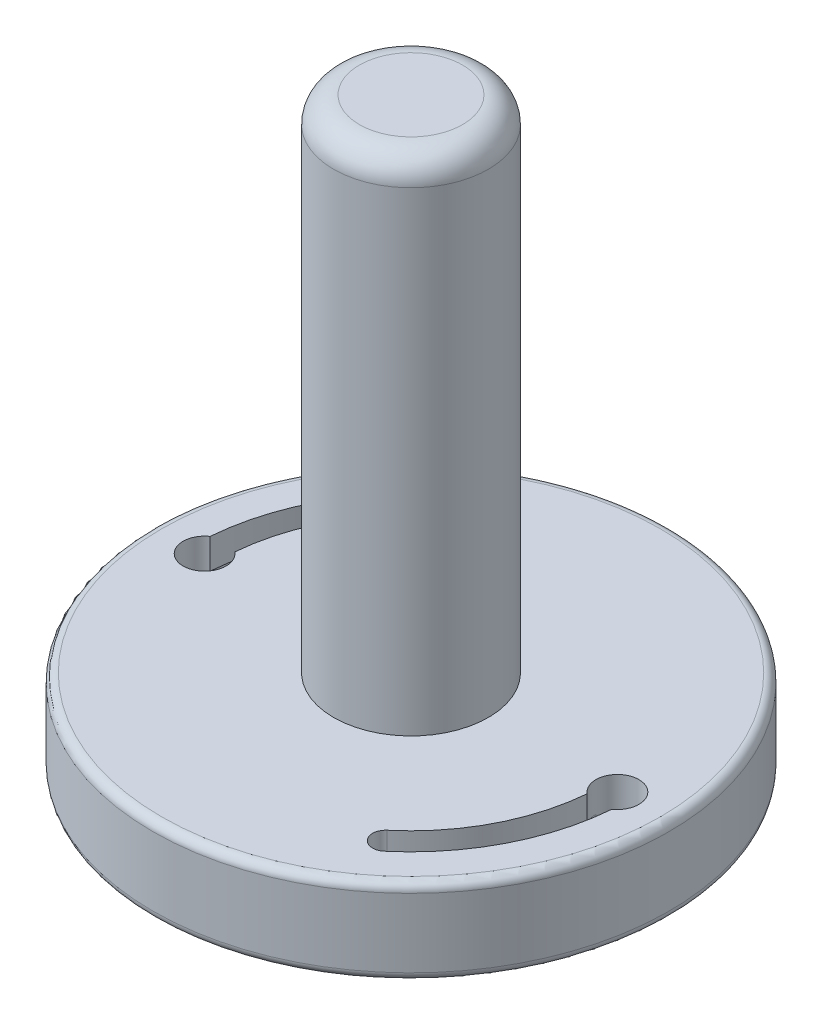
ISO-10303-21;
HEADER;
FILE_DESCRIPTION(('STEP AP214'),'2;1');
FILE_NAME('part.step','',(''),(''),'','','');
FILE_SCHEMA(('AUTOMOTIVE_DESIGN { 1 0 10303 214 1 1 1 1 }'));
ENDSEC;
DATA;
#1=APPLICATION_CONTEXT('core data for automotive mechanical design processes');
#2=APPLICATION_PROTOCOL_DEFINITION('international standard','automotive_design',2000,#1);
#3=PRODUCT_CONTEXT('',#1,'mechanical');
#4=PRODUCT('Part','Part','',(#3));
#5=PRODUCT_RELATED_PRODUCT_CATEGORY('part','',(#4));
#6=PRODUCT_DEFINITION_FORMATION('','',#4);
#7=PRODUCT_DEFINITION_CONTEXT('part definition',#1,'design');
#8=PRODUCT_DEFINITION('design','',#6,#7);
#9=PRODUCT_DEFINITION_SHAPE('','',#8);
#10=(LENGTH_UNIT() NAMED_UNIT(*) SI_UNIT(.MILLI.,.METRE.));
#11=(NAMED_UNIT(*) PLANE_ANGLE_UNIT() SI_UNIT($,.RADIAN.));
#12=(NAMED_UNIT(*) SI_UNIT($,.STERADIAN.) SOLID_ANGLE_UNIT());
#13=UNCERTAINTY_MEASURE_WITH_UNIT(LENGTH_MEASURE(1.E-05),#10,'distance_accuracy_value','');
#14=(GEOMETRIC_REPRESENTATION_CONTEXT(3) GLOBAL_UNCERTAINTY_ASSIGNED_CONTEXT((#13)) GLOBAL_UNIT_ASSIGNED_CONTEXT((#10,
#11,#12)) REPRESENTATION_CONTEXT('',''));
#15=CARTESIAN_POINT('',(0.,0.,0.));
#16=DIRECTION('',(0.,0.,1.));
#17=DIRECTION('',(1.,0.,0.));
#18=AXIS2_PLACEMENT_3D('',#15,#16,#17);
#19=CARTESIAN_POINT('',(0.,12.7,0.));
#20=DIRECTION('',(0.,-1.,0.));
#21=DIRECTION('',(0.,0.,-1.));
#22=AXIS2_PLACEMENT_3D('',#19,#20,#21);
#23=CYLINDRICAL_SURFACE('',#22,38.1);
#24=CARTESIAN_POINT('',(0.,1.27,0.));
#25=DIRECTION('',(0.,1.,0.));
#26=DIRECTION('',(0.,0.,1.));
#27=AXIS2_PLACEMENT_3D('',#24,#25,#26);
#28=CIRCLE('',#27,38.1);
#29=CARTESIAN_POINT('',(0.,1.27,38.1));
#30=VERTEX_POINT('',#29);
#31=EDGE_CURVE('E284',#30,#30,#28,.T.);
#32=ORIENTED_EDGE('',*,*,#31,.T.);
#33=EDGE_LOOP('',(#32));
#34=FACE_BOUND('',#33,.T.);
#35=CARTESIAN_POINT('',(0.,11.43,0.));
#36=DIRECTION('',(0.,1.,0.));
#37=DIRECTION('',(0.,0.,1.));
#38=AXIS2_PLACEMENT_3D('',#35,#36,#37);
#39=CIRCLE('',#38,38.1);
#40=CARTESIAN_POINT('',(0.,11.43,38.1));
#41=VERTEX_POINT('',#40);
#42=EDGE_CURVE('E281',#41,#41,#39,.F.);
#43=ORIENTED_EDGE('',*,*,#42,.T.);
#44=EDGE_LOOP('',(#43));
#45=FACE_BOUND('',#44,.T.);
#46=ADVANCED_FACE('F35',(#34,#45),#23,.T.);
#47=CARTESIAN_POINT('',(0.,12.7,0.));
#48=DIRECTION('',(0.,1.,0.));
#49=DIRECTION('',(0.,0.,1.));
#50=AXIS2_PLACEMENT_3D('',#47,#48,#49);
#51=PLANE('',#50);
#52=CARTESIAN_POINT('',(0.,12.7,0.));
#53=DIRECTION('',(0.,1.,0.));
#54=DIRECTION('',(0.,0.,1.));
#55=AXIS2_PLACEMENT_3D('',#52,#53,#54);
#56=CIRCLE('',#55,32.385);
#57=CARTESIAN_POINT('',(20.8166767396913,12.7,24.8083492904142));
#58=VERTEX_POINT('',#57);
#59=CARTESIAN_POINT('',(32.2791666666659,12.7,2.61603216830468));
#60=VERTEX_POINT('',#59);
#61=EDGE_CURVE('E50',#58,#60,#56,.T.);
#62=ORIENTED_EDGE('',*,*,#61,.F.);
#63=CARTESIAN_POINT('',(19.5921663432389,12.7,23.3490346262722));
#64=DIRECTION('',(0.,1.,0.));
#65=DIRECTION('',(0.,0.,1.));
#66=AXIS2_PLACEMENT_3D('',#63,#64,#65);
#67=CIRCLE('',#66,1.905);
#68=CARTESIAN_POINT('',(18.3676559467864,12.7,21.8897199621302));
#69=VERTEX_POINT('',#68);
#70=EDGE_CURVE('E225',#69,#58,#67,.T.);
#71=ORIENTED_EDGE('',*,*,#70,.F.);
#72=CARTESIAN_POINT('',(0.,12.7,0.));
#73=DIRECTION('',(0.,-1.,0.));
#74=DIRECTION('',(0.,0.,1.));
#75=AXIS2_PLACEMENT_3D('',#72,#73,#74);
#76=CIRCLE('',#75,28.575);
#77=CARTESIAN_POINT('',(28.4691666666659,12.7,2.45706619886328));
#78=VERTEX_POINT('',#77);
#79=EDGE_CURVE('E236',#78,#69,#76,.T.);
#80=ORIENTED_EDGE('',*,*,#79,.F.);
#81=CARTESIAN_POINT('',(30.48,12.7,8.88324318369062E-12));
#82=DIRECTION('',(0.,1.,0.));
#83=DIRECTION('',(0.,0.,1.));
#84=AXIS2_PLACEMENT_3D('',#81,#82,#83);
#85=CIRCLE('',#84,3.17500000000002);
#86=EDGE_CURVE('E234',#60,#78,#85,.T.);
#87=ORIENTED_EDGE('',*,*,#86,.F.);
#88=EDGE_LOOP('',(#62,#71,#80,#87));
#89=FACE_BOUND('',#88,.T.);
#90=CARTESIAN_POINT('',(0.,12.7,0.));
#91=DIRECTION('',(0.,1.,0.));
#92=DIRECTION('',(0.,0.,1.));
#93=AXIS2_PLACEMENT_3D('',#90,#91,#92);
#94=CIRCLE('',#93,32.385);
#95=CARTESIAN_POINT('',(-20.8166767396985,12.7,-24.8083492904081));
#96=VERTEX_POINT('',#95);
#97=CARTESIAN_POINT('',(-32.2791666666667,12.7,-2.61603216829525));
#98=VERTEX_POINT('',#97);
#99=EDGE_CURVE('E58',#96,#98,#94,.T.);
#100=ORIENTED_EDGE('',*,*,#99,.F.);
#101=CARTESIAN_POINT('',(-19.5921663432457,12.7,-23.3490346262665));
#102=DIRECTION('',(0.,1.,0.));
#103=DIRECTION('',(0.,0.,1.));
#104=AXIS2_PLACEMENT_3D('',#101,#102,#103);
#105=CIRCLE('',#104,1.905);
#106=CARTESIAN_POINT('',(-18.3676559467928,12.7,-21.8897199621248));
#107=VERTEX_POINT('',#106);
#108=EDGE_CURVE('E251',#107,#96,#105,.T.);
#109=ORIENTED_EDGE('',*,*,#108,.F.);
#110=CARTESIAN_POINT('',(0.,12.7,0.));
#111=DIRECTION('',(0.,-1.,0.));
#112=DIRECTION('',(0.,0.,1.));
#113=AXIS2_PLACEMENT_3D('',#110,#111,#112);
#114=CIRCLE('',#113,28.575);
#115=CARTESIAN_POINT('',(-28.4691666666667,12.7,-2.45706619885496));
#116=VERTEX_POINT('',#115);
#117=EDGE_CURVE('E263',#116,#107,#114,.T.);
#118=ORIENTED_EDGE('',*,*,#117,.F.);
#119=CARTESIAN_POINT('',(-30.48,12.7,0.));
#120=DIRECTION('',(0.,1.,0.));
#121=DIRECTION('',(0.,0.,1.));
#122=AXIS2_PLACEMENT_3D('',#119,#120,#121);
#123=CIRCLE('',#122,3.17499999999999);
#124=EDGE_CURVE('E260',#98,#116,#123,.T.);
#125=ORIENTED_EDGE('',*,*,#124,.F.);
#126=EDGE_LOOP('',(#100,#109,#118,#125));
#127=FACE_BOUND('',#126,.T.);
#128=CARTESIAN_POINT('',(0.,12.7,0.));
#129=DIRECTION('',(0.,1.,0.));
#130=DIRECTION('',(0.,0.,1.));
#131=AXIS2_PLACEMENT_3D('',#128,#129,#130);
#132=CIRCLE('',#131,36.83);
#133=CARTESIAN_POINT('',(0.,12.7,36.83));
#134=VERTEX_POINT('',#133);
#135=EDGE_CURVE('E278',#134,#134,#132,.T.);
#136=ORIENTED_EDGE('',*,*,#135,.T.);
#137=EDGE_LOOP('',(#136));
#138=FACE_BOUND('',#137,.T.);
#139=CARTESIAN_POINT('',(0.,12.7,0.));
#140=DIRECTION('',(0.,1.,0.));
#141=DIRECTION('',(0.,0.,1.));
#142=AXIS2_PLACEMENT_3D('',#139,#140,#141);
#143=CIRCLE('',#142,11.43);
#144=CARTESIAN_POINT('',(0.,12.7,11.43));
#145=VERTEX_POINT('',#144);
#146=EDGE_CURVE('E270',#145,#145,#143,.T.);
#147=ORIENTED_EDGE('',*,*,#146,.F.);
#148=EDGE_LOOP('',(#147));
#149=FACE_BOUND('',#148,.T.);
#150=ADVANCED_FACE('F308',(#89,#127,#138,#149),#51,.T.);
#151=CARTESIAN_POINT('',(0.,0.,0.));
#152=DIRECTION('',(0.,1.,0.));
#153=DIRECTION('',(0.,0.,1.));
#154=AXIS2_PLACEMENT_3D('',#151,#152,#153);
#155=PLANE('',#154);
#156=CARTESIAN_POINT('',(0.,0.,0.));
#157=DIRECTION('',(0.,1.,0.));
#158=DIRECTION('',(0.,0.,1.));
#159=AXIS2_PLACEMENT_3D('',#156,#157,#158);
#160=CIRCLE('',#159,36.83);
#161=CARTESIAN_POINT('',(0.,0.,36.83));
#162=VERTEX_POINT('',#161);
#163=EDGE_CURVE('E287',#162,#162,#160,.F.);
#164=ORIENTED_EDGE('',*,*,#163,.T.);
#165=EDGE_LOOP('',(#164));
#166=FACE_BOUND('',#165,.T.);
#167=ADVANCED_FACE('F315',(#166),#155,.F.);
#168=CARTESIAN_POINT('',(0.,86.614,0.));
#169=DIRECTION('',(0.,-1.,0.));
#170=DIRECTION('',(0.,0.,-1.));
#171=AXIS2_PLACEMENT_3D('',#168,#169,#170);
#172=CYLINDRICAL_SURFACE('',#171,11.43);
#173=CARTESIAN_POINT('',(0.,82.804,0.));
#174=DIRECTION('',(0.,1.,0.));
#175=DIRECTION('',(0.,0.,1.));
#176=AXIS2_PLACEMENT_3D('',#173,#174,#175);
#177=CIRCLE('',#176,11.43);
#178=CARTESIAN_POINT('',(0.,82.804,11.43));
#179=VERTEX_POINT('',#178);
#180=EDGE_CURVE('E11',#179,#179,#177,.F.);
#181=ORIENTED_EDGE('',*,*,#180,.T.);
#182=EDGE_LOOP('',(#181));
#183=FACE_BOUND('',#182,.T.);
#184=ORIENTED_EDGE('',*,*,#146,.T.);
#185=EDGE_LOOP('',(#184));
#186=FACE_BOUND('',#185,.T.);
#187=ADVANCED_FACE('F326',(#183,#186),#172,.T.);
#188=CARTESIAN_POINT('',(0.,86.614,0.));
#189=DIRECTION('',(0.,1.,0.));
#190=DIRECTION('',(0.,0.,1.));
#191=AXIS2_PLACEMENT_3D('',#188,#189,#190);
#192=PLANE('',#191);
#193=CARTESIAN_POINT('',(0.,86.614,0.));
#194=DIRECTION('',(0.,1.,0.));
#195=DIRECTION('',(0.,0.,1.));
#196=AXIS2_PLACEMENT_3D('',#193,#194,#195);
#197=CIRCLE('',#196,7.62);
#198=CARTESIAN_POINT('',(0.,86.614,7.62));
#199=VERTEX_POINT('',#198);
#200=EDGE_CURVE('E43',#199,#199,#197,.T.);
#201=ORIENTED_EDGE('',*,*,#200,.T.);
#202=EDGE_LOOP('',(#201));
#203=FACE_BOUND('',#202,.T.);
#204=ADVANCED_FACE('F292',(#203),#192,.T.);
#205=CARTESIAN_POINT('',(0.,11.43,0.));
#206=DIRECTION('',(0.,1.,0.));
#207=DIRECTION('',(0.,0.,1.));
#208=AXIS2_PLACEMENT_3D('',#205,#206,#207);
#209=TOROIDAL_SURFACE('',#208,36.83,1.27);
#210=ORIENTED_EDGE('',*,*,#42,.F.);
#211=EDGE_LOOP('',(#210));
#212=FACE_BOUND('',#211,.T.);
#213=ORIENTED_EDGE('',*,*,#135,.F.);
#214=EDGE_LOOP('',(#213));
#215=FACE_BOUND('',#214,.T.);
#216=ADVANCED_FACE('F304',(#212,#215),#209,.T.);
#217=CARTESIAN_POINT('',(0.,1.27,0.));
#218=DIRECTION('',(0.,1.,0.));
#219=DIRECTION('',(0.,0.,1.));
#220=AXIS2_PLACEMENT_3D('',#217,#218,#219);
#221=TOROIDAL_SURFACE('',#220,36.83,1.27);
#222=ORIENTED_EDGE('',*,*,#163,.F.);
#223=EDGE_LOOP('',(#222));
#224=FACE_BOUND('',#223,.T.);
#225=ORIENTED_EDGE('',*,*,#31,.F.);
#226=EDGE_LOOP('',(#225));
#227=FACE_BOUND('',#226,.T.);
#228=ADVANCED_FACE('F296',(#224,#227),#221,.T.);
#229=CARTESIAN_POINT('',(0.,82.804,0.));
#230=DIRECTION('',(0.,1.,0.));
#231=DIRECTION('',(0.,0.,1.));
#232=AXIS2_PLACEMENT_3D('',#229,#230,#231);
#233=TOROIDAL_SURFACE('',#232,7.62,3.81);
#234=ORIENTED_EDGE('',*,*,#180,.F.);
#235=EDGE_LOOP('',(#234));
#236=FACE_BOUND('',#235,.T.);
#237=ORIENTED_EDGE('',*,*,#200,.F.);
#238=EDGE_LOOP('',(#237));
#239=FACE_BOUND('',#238,.T.);
#240=ADVANCED_FACE('F37',(#236,#239),#233,.T.);
#241=CARTESIAN_POINT('',(0.,8.255,0.));
#242=DIRECTION('',(0.,1.,0.));
#243=DIRECTION('',(0.,0.,1.));
#244=AXIS2_PLACEMENT_3D('',#241,#242,#243);
#245=CYLINDRICAL_SURFACE('',#244,32.385);
#246=ORIENTED_EDGE('',*,*,#99,.T.);
#247=DIRECTION('',(0.,1.,0.));
#248=VECTOR('',#247,1.);
#249=CARTESIAN_POINT('',(-32.2791666666667,8.255,-2.61603216829525));
#250=LINE('',#249,#248);
#251=CARTESIAN_POINT('',(-32.2791666666667,8.255,-2.61603216829525));
#252=VERTEX_POINT('',#251);
#253=EDGE_CURVE('E258',#252,#98,#250,.T.);
#254=ORIENTED_EDGE('',*,*,#253,.F.);
#255=CARTESIAN_POINT('',(0.,8.255,0.));
#256=DIRECTION('',(0.,1.,0.));
#257=DIRECTION('',(0.,0.,1.));
#258=AXIS2_PLACEMENT_3D('',#255,#256,#257);
#259=CIRCLE('',#258,32.385);
#260=CARTESIAN_POINT('',(-20.8166767396985,8.255,-24.8083492904081));
#261=VERTEX_POINT('',#260);
#262=EDGE_CURVE('E248',#261,#252,#259,.T.);
#263=ORIENTED_EDGE('',*,*,#262,.F.);
#264=DIRECTION('',(0.,1.,0.));
#265=VECTOR('',#264,1.);
#266=CARTESIAN_POINT('',(-20.8166767396985,8.255,-24.8083492904081));
#267=LINE('',#266,#265);
#268=EDGE_CURVE('E268',#261,#96,#267,.T.);
#269=ORIENTED_EDGE('',*,*,#268,.T.);
#270=EDGE_LOOP('',(#246,#254,#263,#269));
#271=FACE_BOUND('',#270,.T.);
#272=ADVANCED_FACE('F295',(#271),#245,.F.);
#273=CARTESIAN_POINT('',(-19.5921663432457,8.255,-23.3490346262665));
#274=DIRECTION('',(0.,1.,0.));
#275=DIRECTION('',(0.,0.,1.));
#276=AXIS2_PLACEMENT_3D('',#273,#274,#275);
#277=CYLINDRICAL_SURFACE('',#276,1.905);
#278=ORIENTED_EDGE('',*,*,#108,.T.);
#279=ORIENTED_EDGE('',*,*,#268,.F.);
#280=CARTESIAN_POINT('',(-19.5921663432457,8.255,-23.3490346262665));
#281=DIRECTION('',(0.,1.,0.));
#282=DIRECTION('',(0.,0.,1.));
#283=AXIS2_PLACEMENT_3D('',#280,#281,#282);
#284=CIRCLE('',#283,1.905);
#285=CARTESIAN_POINT('',(-18.3676559467928,8.255,-21.8897199621248));
#286=VERTEX_POINT('',#285);
#287=EDGE_CURVE('E256',#286,#261,#284,.T.);
#288=ORIENTED_EDGE('',*,*,#287,.F.);
#289=DIRECTION('',(0.,1.,0.));
#290=VECTOR('',#289,1.);
#291=CARTESIAN_POINT('',(-18.3676559467928,8.255,-21.8897199621248));
#292=LINE('',#291,#290);
#293=EDGE_CURVE('E271',#286,#107,#292,.T.);
#294=ORIENTED_EDGE('',*,*,#293,.T.);
#295=EDGE_LOOP('',(#278,#279,#288,#294));
#296=FACE_BOUND('',#295,.T.);
#297=ADVANCED_FACE('F302',(#296),#277,.F.);
#298=CARTESIAN_POINT('',(0.,8.255,0.));
#299=DIRECTION('',(0.,1.,0.));
#300=DIRECTION('',(0.,0.,1.));
#301=AXIS2_PLACEMENT_3D('',#298,#299,#300);
#302=CYLINDRICAL_SURFACE('',#301,28.575);
#303=ORIENTED_EDGE('',*,*,#117,.T.);
#304=ORIENTED_EDGE('',*,*,#293,.F.);
#305=CARTESIAN_POINT('',(0.,8.255,0.));
#306=DIRECTION('',(0.,-1.,0.));
#307=DIRECTION('',(0.,0.,1.));
#308=AXIS2_PLACEMENT_3D('',#305,#306,#307);
#309=CIRCLE('',#308,28.575);
#310=CARTESIAN_POINT('',(-28.4691666666667,8.255,-2.45706619885496));
#311=VERTEX_POINT('',#310);
#312=EDGE_CURVE('E254',#311,#286,#309,.T.);
#313=ORIENTED_EDGE('',*,*,#312,.F.);
#314=DIRECTION('',(0.,1.,0.));
#315=VECTOR('',#314,1.);
#316=CARTESIAN_POINT('',(-28.4691666666667,8.255,-2.45706619885496));
#317=LINE('',#316,#315);
#318=EDGE_CURVE('E273',#311,#116,#317,.T.);
#319=ORIENTED_EDGE('',*,*,#318,.T.);
#320=EDGE_LOOP('',(#303,#304,#313,#319));
#321=FACE_BOUND('',#320,.T.);
#322=ADVANCED_FACE('F347',(#321),#302,.T.);
#323=CARTESIAN_POINT('',(-30.48,8.255,0.));
#324=DIRECTION('',(0.,1.,0.));
#325=DIRECTION('',(0.,0.,1.));
#326=AXIS2_PLACEMENT_3D('',#323,#324,#325);
#327=CYLINDRICAL_SURFACE('',#326,3.17499999999999);
#328=ORIENTED_EDGE('',*,*,#124,.T.);
#329=ORIENTED_EDGE('',*,*,#318,.F.);
#330=CARTESIAN_POINT('',(-30.48,8.255,0.));
#331=DIRECTION('',(0.,1.,0.));
#332=DIRECTION('',(0.,0.,1.));
#333=AXIS2_PLACEMENT_3D('',#330,#331,#332);
#334=CIRCLE('',#333,3.17499999999999);
#335=CARTESIAN_POINT('',(-27.305,8.255,0.));
#336=VERTEX_POINT('',#335);
#337=EDGE_CURVE('E250',#336,#311,#334,.T.);
#338=ORIENTED_EDGE('',*,*,#337,.F.);
#339=DIRECTION('',(0.,1.,0.));
#340=VECTOR('',#339,1.);
#341=CARTESIAN_POINT('',(-27.305,5.08,0.));
#342=LINE('',#341,#340);
#343=CARTESIAN_POINT('',(-27.305,5.08,0.));
#344=VERTEX_POINT('',#343);
#345=EDGE_CURVE('E206',#344,#336,#342,.T.);
#346=ORIENTED_EDGE('',*,*,#345,.F.);
#347=CARTESIAN_POINT('',(-30.48,5.08,0.));
#348=DIRECTION('',(0.,1.,0.));
#349=DIRECTION('',(0.,0.,1.));
#350=AXIS2_PLACEMENT_3D('',#347,#348,#349);
#351=CIRCLE('',#350,3.17500000000004);
#352=CARTESIAN_POINT('',(-33.655,5.08,0.));
#353=VERTEX_POINT('',#352);
#354=EDGE_CURVE('E193',#353,#344,#351,.T.);
#355=ORIENTED_EDGE('',*,*,#354,.F.);
#356=DIRECTION('',(0.,1.,0.));
#357=VECTOR('',#356,1.);
#358=CARTESIAN_POINT('',(-33.655,5.08,0.));
#359=LINE('',#358,#357);
#360=CARTESIAN_POINT('',(-33.655,8.255,0.));
#361=VERTEX_POINT('',#360);
#362=EDGE_CURVE('E214',#353,#361,#359,.T.);
#363=ORIENTED_EDGE('',*,*,#362,.T.);
#364=EDGE_CURVE('E252',#252,#361,#334,.T.);
#365=ORIENTED_EDGE('',*,*,#364,.F.);
#366=ORIENTED_EDGE('',*,*,#253,.T.);
#367=EDGE_LOOP('',(#328,#329,#338,#346,#355,#363,#365,#366));
#368=FACE_BOUND('',#367,.T.);
#369=ADVANCED_FACE('F343',(#368),#327,.F.);
#370=CARTESIAN_POINT('',(0.,8.255,0.));
#371=DIRECTION('',(0.,1.,0.));
#372=DIRECTION('',(0.,0.,1.));
#373=AXIS2_PLACEMENT_3D('',#370,#371,#372);
#374=CYLINDRICAL_SURFACE('',#373,32.385);
#375=ORIENTED_EDGE('',*,*,#61,.T.);
#376=DIRECTION('',(0.,1.,0.));
#377=VECTOR('',#376,1.);
#378=CARTESIAN_POINT('',(32.2791666666659,8.255,2.61603216830468));
#379=LINE('',#378,#377);
#380=CARTESIAN_POINT('',(32.2791666666659,8.255,2.61603216830468));
#381=VERTEX_POINT('',#380);
#382=EDGE_CURVE('E232',#381,#60,#379,.T.);
#383=ORIENTED_EDGE('',*,*,#382,.F.);
#384=CARTESIAN_POINT('',(0.,8.255,0.));
#385=DIRECTION('',(0.,1.,0.));
#386=DIRECTION('',(0.,0.,1.));
#387=AXIS2_PLACEMENT_3D('',#384,#385,#386);
#388=CIRCLE('',#387,32.385);
#389=CARTESIAN_POINT('',(20.8166767396913,8.255,24.8083492904142));
#390=VERTEX_POINT('',#389);
#391=EDGE_CURVE('E222',#390,#381,#388,.T.);
#392=ORIENTED_EDGE('',*,*,#391,.F.);
#393=DIRECTION('',(0.,1.,0.));
#394=VECTOR('',#393,1.);
#395=CARTESIAN_POINT('',(20.8166767396913,8.255,24.8083492904142));
#396=LINE('',#395,#394);
#397=EDGE_CURVE('E241',#390,#58,#396,.T.);
#398=ORIENTED_EDGE('',*,*,#397,.T.);
#399=EDGE_LOOP('',(#375,#383,#392,#398));
#400=FACE_BOUND('',#399,.T.);
#401=ADVANCED_FACE('F346',(#400),#374,.F.);
#402=CARTESIAN_POINT('',(19.5921663432389,8.255,23.3490346262722));
#403=DIRECTION('',(0.,1.,0.));
#404=DIRECTION('',(0.,0.,1.));
#405=AXIS2_PLACEMENT_3D('',#402,#403,#404);
#406=CYLINDRICAL_SURFACE('',#405,1.905);
#407=ORIENTED_EDGE('',*,*,#70,.T.);
#408=ORIENTED_EDGE('',*,*,#397,.F.);
#409=CARTESIAN_POINT('',(19.5921663432389,8.255,23.3490346262722));
#410=DIRECTION('',(0.,1.,0.));
#411=DIRECTION('',(0.,0.,1.));
#412=AXIS2_PLACEMENT_3D('',#409,#410,#411);
#413=CIRCLE('',#412,1.905);
#414=CARTESIAN_POINT('',(18.3676559467864,8.255,21.8897199621302));
#415=VERTEX_POINT('',#414);
#416=EDGE_CURVE('E230',#415,#390,#413,.T.);
#417=ORIENTED_EDGE('',*,*,#416,.F.);
#418=DIRECTION('',(0.,1.,0.));
#419=VECTOR('',#418,1.);
#420=CARTESIAN_POINT('',(18.3676559467864,8.255,21.8897199621302));
#421=LINE('',#420,#419);
#422=EDGE_CURVE('E243',#415,#69,#421,.T.);
#423=ORIENTED_EDGE('',*,*,#422,.T.);
#424=EDGE_LOOP('',(#407,#408,#417,#423));
#425=FACE_BOUND('',#424,.T.);
#426=ADVANCED_FACE('F357',(#425),#406,.F.);
#427=CARTESIAN_POINT('',(0.,8.255,0.));
#428=DIRECTION('',(0.,1.,0.));
#429=DIRECTION('',(0.,0.,1.));
#430=AXIS2_PLACEMENT_3D('',#427,#428,#429);
#431=CYLINDRICAL_SURFACE('',#430,28.575);
#432=ORIENTED_EDGE('',*,*,#79,.T.);
#433=ORIENTED_EDGE('',*,*,#422,.F.);
#434=CARTESIAN_POINT('',(0.,8.255,0.));
#435=DIRECTION('',(0.,-1.,0.));
#436=DIRECTION('',(0.,0.,1.));
#437=AXIS2_PLACEMENT_3D('',#434,#435,#436);
#438=CIRCLE('',#437,28.575);
#439=CARTESIAN_POINT('',(28.4691666666659,8.255,2.45706619886328));
#440=VERTEX_POINT('',#439);
#441=EDGE_CURVE('E228',#440,#415,#438,.T.);
#442=ORIENTED_EDGE('',*,*,#441,.F.);
#443=DIRECTION('',(0.,1.,0.));
#444=VECTOR('',#443,1.);
#445=CARTESIAN_POINT('',(28.4691666666659,8.255,2.45706619886328));
#446=LINE('',#445,#444);
#447=EDGE_CURVE('E245',#440,#78,#446,.T.);
#448=ORIENTED_EDGE('',*,*,#447,.T.);
#449=EDGE_LOOP('',(#432,#433,#442,#448));
#450=FACE_BOUND('',#449,.T.);
#451=ADVANCED_FACE('F361',(#450),#431,.T.);
#452=CARTESIAN_POINT('',(30.48,8.255,8.88324318369062E-12));
#453=DIRECTION('',(0.,1.,0.));
#454=DIRECTION('',(0.,0.,1.));
#455=AXIS2_PLACEMENT_3D('',#452,#453,#454);
#456=CYLINDRICAL_SURFACE('',#455,3.17500000000002);
#457=ORIENTED_EDGE('',*,*,#86,.T.);
#458=ORIENTED_EDGE('',*,*,#447,.F.);
#459=CARTESIAN_POINT('',(30.48,8.255,8.88324318369062E-12));
#460=DIRECTION('',(0.,1.,0.));
#461=DIRECTION('',(0.,0.,1.));
#462=AXIS2_PLACEMENT_3D('',#459,#460,#461);
#463=CIRCLE('',#462,3.17500000000002);
#464=CARTESIAN_POINT('',(27.305,8.255,1.896977325174E-13));
#465=VERTEX_POINT('',#464);
#466=EDGE_CURVE('E224',#465,#440,#463,.T.);
#467=ORIENTED_EDGE('',*,*,#466,.F.);
#468=DIRECTION('',(0.,1.,0.));
#469=VECTOR('',#468,1.);
#470=CARTESIAN_POINT('',(27.305,5.08,1.896977325174E-13));
#471=LINE('',#470,#469);
#472=CARTESIAN_POINT('',(27.305,5.08,1.896977325174E-13));
#473=VERTEX_POINT('',#472);
#474=EDGE_CURVE('E161',#473,#465,#471,.T.);
#475=ORIENTED_EDGE('',*,*,#474,.F.);
#476=CARTESIAN_POINT('',(30.48,5.08,2.12840702415877E-13));
#477=DIRECTION('',(0.,1.,0.));
#478=DIRECTION('',(0.,0.,1.));
#479=AXIS2_PLACEMENT_3D('',#476,#477,#478);
#480=CIRCLE('',#479,3.17500000000004);
#481=CARTESIAN_POINT('',(33.655,5.08,2.34889855334989E-13));
#482=VERTEX_POINT('',#481);
#483=EDGE_CURVE('E165',#482,#473,#480,.T.);
#484=ORIENTED_EDGE('',*,*,#483,.F.);
#485=DIRECTION('',(0.,1.,0.));
#486=VECTOR('',#485,1.);
#487=CARTESIAN_POINT('',(33.655,5.08,2.34889855334989E-13));
#488=LINE('',#487,#486);
#489=CARTESIAN_POINT('',(33.655,8.255,2.34889855334989E-13));
#490=VERTEX_POINT('',#489);
#491=EDGE_CURVE('E151',#482,#490,#488,.T.);
#492=ORIENTED_EDGE('',*,*,#491,.T.);
#493=EDGE_CURVE('E226',#381,#490,#463,.T.);
#494=ORIENTED_EDGE('',*,*,#493,.F.);
#495=ORIENTED_EDGE('',*,*,#382,.T.);
#496=EDGE_LOOP('',(#457,#458,#467,#475,#484,#492,#494,#495));
#497=FACE_BOUND('',#496,.T.);
#498=ADVANCED_FACE('F167',(#497),#456,.F.);
#499=CARTESIAN_POINT('',(0.,5.08,0.));
#500=DIRECTION('',(0.,1.,0.));
#501=DIRECTION('',(0.,0.,1.));
#502=AXIS2_PLACEMENT_3D('',#499,#500,#501);
#503=CYLINDRICAL_SURFACE('',#502,33.655);
#504=CARTESIAN_POINT('',(0.,8.255,0.));
#505=DIRECTION('',(0.,1.,0.));
#506=DIRECTION('',(0.,0.,1.));
#507=AXIS2_PLACEMENT_3D('',#504,#505,#506);
#508=CIRCLE('',#507,33.655);
#509=CARTESIAN_POINT('',(-21.6330170040004,8.255,-25.7812257331693));
#510=VERTEX_POINT('',#509);
#511=EDGE_CURVE('E197',#510,#361,#508,.T.);
#512=ORIENTED_EDGE('',*,*,#511,.T.);
#513=ORIENTED_EDGE('',*,*,#362,.F.);
#514=CARTESIAN_POINT('',(0.,5.08,0.));
#515=DIRECTION('',(0.,1.,0.));
#516=DIRECTION('',(0.,0.,1.));
#517=AXIS2_PLACEMENT_3D('',#514,#515,#516);
#518=CIRCLE('',#517,33.655);
#519=CARTESIAN_POINT('',(-21.6330170040004,5.08,-25.7812257331693));
#520=VERTEX_POINT('',#519);
#521=EDGE_CURVE('E203',#520,#353,#518,.T.);
#522=ORIENTED_EDGE('',*,*,#521,.F.);
#523=DIRECTION('',(0.,1.,0.));
#524=VECTOR('',#523,1.);
#525=CARTESIAN_POINT('',(-21.6330170040004,5.08,-25.7812257331693));
#526=LINE('',#525,#524);
#527=EDGE_CURVE('E217',#520,#510,#526,.T.);
#528=ORIENTED_EDGE('',*,*,#527,.T.);
#529=EDGE_LOOP('',(#512,#513,#522,#528));
#530=FACE_BOUND('',#529,.T.);
#531=ADVANCED_FACE('F360',(#530),#503,.F.);
#532=CARTESIAN_POINT('',(-19.5921663432457,5.08,-23.3490346262665));
#533=DIRECTION('',(0.,1.,0.));
#534=DIRECTION('',(0.,0.,1.));
#535=AXIS2_PLACEMENT_3D('',#532,#533,#534);
#536=CYLINDRICAL_SURFACE('',#535,3.175);
#537=CARTESIAN_POINT('',(-19.5921663432457,8.255,-23.3490346262665));
#538=DIRECTION('',(0.,1.,0.));
#539=DIRECTION('',(0.,0.,1.));
#540=AXIS2_PLACEMENT_3D('',#537,#538,#539);
#541=CIRCLE('',#540,3.175);
#542=CARTESIAN_POINT('',(-17.5513156824909,8.255,-20.9168435193637));
#543=VERTEX_POINT('',#542);
#544=EDGE_CURVE('E209',#543,#510,#541,.T.);
#545=ORIENTED_EDGE('',*,*,#544,.T.);
#546=ORIENTED_EDGE('',*,*,#527,.F.);
#547=CARTESIAN_POINT('',(-19.5921663432457,5.08,-23.3490346262665));
#548=DIRECTION('',(0.,1.,0.));
#549=DIRECTION('',(0.,0.,1.));
#550=AXIS2_PLACEMENT_3D('',#547,#548,#549);
#551=CIRCLE('',#550,3.175);
#552=CARTESIAN_POINT('',(-17.5513156824909,5.08,-20.9168435193637));
#553=VERTEX_POINT('',#552);
#554=EDGE_CURVE('E200',#553,#520,#551,.T.);
#555=ORIENTED_EDGE('',*,*,#554,.F.);
#556=DIRECTION('',(0.,1.,0.));
#557=VECTOR('',#556,1.);
#558=CARTESIAN_POINT('',(-17.5513156824909,5.08,-20.9168435193637));
#559=LINE('',#558,#557);
#560=EDGE_CURVE('E219',#553,#543,#559,.T.);
#561=ORIENTED_EDGE('',*,*,#560,.T.);
#562=EDGE_LOOP('',(#545,#546,#555,#561));
#563=FACE_BOUND('',#562,.T.);
#564=ADVANCED_FACE('F372',(#563),#536,.F.);
#565=CARTESIAN_POINT('',(0.,5.08,0.));
#566=DIRECTION('',(0.,1.,0.));
#567=DIRECTION('',(0.,0.,1.));
#568=AXIS2_PLACEMENT_3D('',#565,#566,#567);
#569=CYLINDRICAL_SURFACE('',#568,27.305);
#570=CARTESIAN_POINT('',(0.,8.255,0.));
#571=DIRECTION('',(0.,-1.,0.));
#572=DIRECTION('',(0.,0.,1.));
#573=AXIS2_PLACEMENT_3D('',#570,#571,#572);
#574=CIRCLE('',#573,27.305);
#575=EDGE_CURVE('E189',#336,#543,#574,.T.);
#576=ORIENTED_EDGE('',*,*,#575,.T.);
#577=ORIENTED_EDGE('',*,*,#560,.F.);
#578=CARTESIAN_POINT('',(0.,5.08,0.));
#579=DIRECTION('',(0.,-1.,0.));
#580=DIRECTION('',(0.,0.,1.));
#581=AXIS2_PLACEMENT_3D('',#578,#579,#580);
#582=CIRCLE('',#581,27.305);
#583=EDGE_CURVE('E196',#344,#553,#582,.T.);
#584=ORIENTED_EDGE('',*,*,#583,.F.);
#585=ORIENTED_EDGE('',*,*,#345,.T.);
#586=EDGE_LOOP('',(#576,#577,#584,#585));
#587=FACE_BOUND('',#586,.T.);
#588=ADVANCED_FACE('F368',(#587),#569,.T.);
#589=CARTESIAN_POINT('',(-15.24,5.08,0.));
#590=DIRECTION('',(0.,1.,0.));
#591=DIRECTION('',(0.,0.,1.));
#592=AXIS2_PLACEMENT_3D('',#589,#590,#591);
#593=PLANE('',#592);
#594=ORIENTED_EDGE('',*,*,#354,.T.);
#595=ORIENTED_EDGE('',*,*,#583,.T.);
#596=ORIENTED_EDGE('',*,*,#554,.T.);
#597=ORIENTED_EDGE('',*,*,#521,.T.);
#598=EDGE_LOOP('',(#594,#595,#596,#597));
#599=FACE_BOUND('',#598,.T.);
#600=ADVANCED_FACE('F371',(#599),#593,.T.);
#601=CARTESIAN_POINT('',(-15.24,8.255,0.));
#602=DIRECTION('',(0.,1.,0.));
#603=DIRECTION('',(0.,0.,1.));
#604=AXIS2_PLACEMENT_3D('',#601,#602,#603);
#605=PLANE('',#604);
#606=ORIENTED_EDGE('',*,*,#364,.T.);
#607=ORIENTED_EDGE('',*,*,#511,.F.);
#608=ORIENTED_EDGE('',*,*,#544,.F.);
#609=ORIENTED_EDGE('',*,*,#575,.F.);
#610=ORIENTED_EDGE('',*,*,#337,.T.);
#611=ORIENTED_EDGE('',*,*,#312,.T.);
#612=ORIENTED_EDGE('',*,*,#287,.T.);
#613=ORIENTED_EDGE('',*,*,#262,.T.);
#614=EDGE_LOOP('',(#606,#607,#608,#609,#610,#611,#612,#613));
#615=FACE_BOUND('',#614,.T.);
#616=ADVANCED_FACE('F380',(#615),#605,.F.);
#617=CARTESIAN_POINT('',(0.,5.08,0.));
#618=DIRECTION('',(0.,1.,0.));
#619=DIRECTION('',(0.,0.,1.));
#620=AXIS2_PLACEMENT_3D('',#617,#618,#619);
#621=CYLINDRICAL_SURFACE('',#620,33.655);
#622=CARTESIAN_POINT('',(0.,8.255,0.));
#623=DIRECTION('',(0.,1.,0.));
#624=DIRECTION('',(0.,0.,1.));
#625=AXIS2_PLACEMENT_3D('',#622,#623,#624);
#626=CIRCLE('',#625,33.655);
#627=CARTESIAN_POINT('',(21.6330170040003,8.255,25.7812257331694));
#628=VERTEX_POINT('',#627);
#629=EDGE_CURVE('E158',#628,#490,#626,.T.);
#630=ORIENTED_EDGE('',*,*,#629,.T.);
#631=ORIENTED_EDGE('',*,*,#491,.F.);
#632=CARTESIAN_POINT('',(0.,5.08,0.));
#633=DIRECTION('',(0.,1.,0.));
#634=DIRECTION('',(0.,0.,1.));
#635=AXIS2_PLACEMENT_3D('',#632,#633,#634);
#636=CIRCLE('',#635,33.655);
#637=CARTESIAN_POINT('',(21.6330170040003,5.08,25.7812257331694));
#638=VERTEX_POINT('',#637);
#639=EDGE_CURVE('E155',#638,#482,#636,.T.);
#640=ORIENTED_EDGE('',*,*,#639,.F.);
#641=DIRECTION('',(0.,1.,0.));
#642=VECTOR('',#641,1.);
#643=CARTESIAN_POINT('',(21.6330170040003,5.08,25.7812257331694));
#644=LINE('',#643,#642);
#645=EDGE_CURVE('E187',#638,#628,#644,.T.);
#646=ORIENTED_EDGE('',*,*,#645,.T.);
#647=EDGE_LOOP('',(#630,#631,#640,#646));
#648=FACE_BOUND('',#647,.T.);
#649=ADVANCED_FACE('F153',(#648),#621,.F.);
#650=CARTESIAN_POINT('',(19.5921663432455,5.08,23.3490346262666));
#651=DIRECTION('',(0.,1.,0.));
#652=DIRECTION('',(0.,0.,1.));
#653=AXIS2_PLACEMENT_3D('',#650,#651,#652);
#654=CYLINDRICAL_SURFACE('',#653,3.175);
#655=CARTESIAN_POINT('',(19.5921663432455,8.255,23.3490346262666));
#656=DIRECTION('',(0.,1.,0.));
#657=DIRECTION('',(0.,0.,1.));
#658=AXIS2_PLACEMENT_3D('',#655,#656,#657);
#659=CIRCLE('',#658,3.175);
#660=CARTESIAN_POINT('',(17.5513156824908,8.255,20.9168435193638));
#661=VERTEX_POINT('',#660);
#662=EDGE_CURVE('E176',#661,#628,#659,.T.);
#663=ORIENTED_EDGE('',*,*,#662,.T.);
#664=ORIENTED_EDGE('',*,*,#645,.F.);
#665=CARTESIAN_POINT('',(19.5921663432455,5.08,23.3490346262666));
#666=DIRECTION('',(0.,1.,0.));
#667=DIRECTION('',(0.,0.,1.));
#668=AXIS2_PLACEMENT_3D('',#665,#666,#667);
#669=CIRCLE('',#668,3.175);
#670=CARTESIAN_POINT('',(17.5513156824908,5.08,20.9168435193638));
#671=VERTEX_POINT('',#670);
#672=EDGE_CURVE('E162',#671,#638,#669,.T.);
#673=ORIENTED_EDGE('',*,*,#672,.F.);
#674=DIRECTION('',(0.,1.,0.));
#675=VECTOR('',#674,1.);
#676=CARTESIAN_POINT('',(17.5513156824908,5.08,20.9168435193638));
#677=LINE('',#676,#675);
#678=EDGE_CURVE('E190',#671,#661,#677,.T.);
#679=ORIENTED_EDGE('',*,*,#678,.T.);
#680=EDGE_LOOP('',(#663,#664,#673,#679));
#681=FACE_BOUND('',#680,.T.);
#682=ADVANCED_FACE('F389',(#681),#654,.F.);
#683=CARTESIAN_POINT('',(0.,5.08,0.));
#684=DIRECTION('',(0.,1.,0.));
#685=DIRECTION('',(0.,0.,1.));
#686=AXIS2_PLACEMENT_3D('',#683,#684,#685);
#687=CYLINDRICAL_SURFACE('',#686,27.305);
#688=CARTESIAN_POINT('',(0.,8.255,0.));
#689=DIRECTION('',(0.,-1.,0.));
#690=DIRECTION('',(0.,0.,1.));
#691=AXIS2_PLACEMENT_3D('',#688,#689,#690);
#692=CIRCLE('',#691,27.305);
#693=EDGE_CURVE('E179',#465,#661,#692,.T.);
#694=ORIENTED_EDGE('',*,*,#693,.T.);
#695=ORIENTED_EDGE('',*,*,#678,.F.);
#696=CARTESIAN_POINT('',(0.,5.08,0.));
#697=DIRECTION('',(0.,-1.,0.));
#698=DIRECTION('',(0.,0.,1.));
#699=AXIS2_PLACEMENT_3D('',#696,#697,#698);
#700=CIRCLE('',#699,27.305);
#701=EDGE_CURVE('E172',#473,#671,#700,.T.);
#702=ORIENTED_EDGE('',*,*,#701,.F.);
#703=ORIENTED_EDGE('',*,*,#474,.T.);
#704=EDGE_LOOP('',(#694,#695,#702,#703));
#705=FACE_BOUND('',#704,.T.);
#706=ADVANCED_FACE('F390',(#705),#687,.T.);
#707=CARTESIAN_POINT('',(15.24,5.08,1.06420351207939E-13));
#708=DIRECTION('',(0.,1.,0.));
#709=DIRECTION('',(0.,0.,1.));
#710=AXIS2_PLACEMENT_3D('',#707,#708,#709);
#711=PLANE('',#710);
#712=ORIENTED_EDGE('',*,*,#639,.T.);
#713=ORIENTED_EDGE('',*,*,#483,.T.);
#714=ORIENTED_EDGE('',*,*,#701,.T.);
#715=ORIENTED_EDGE('',*,*,#672,.T.);
#716=EDGE_LOOP('',(#712,#713,#714,#715));
#717=FACE_BOUND('',#716,.T.);
#718=ADVANCED_FACE('F174',(#717),#711,.T.);
#719=CARTESIAN_POINT('',(15.24,8.255,1.06420351207939E-13));
#720=DIRECTION('',(0.,1.,0.));
#721=DIRECTION('',(0.,0.,1.));
#722=AXIS2_PLACEMENT_3D('',#719,#720,#721);
#723=PLANE('',#722);
#724=ORIENTED_EDGE('',*,*,#493,.T.);
#725=ORIENTED_EDGE('',*,*,#629,.F.);
#726=ORIENTED_EDGE('',*,*,#662,.F.);
#727=ORIENTED_EDGE('',*,*,#693,.F.);
#728=ORIENTED_EDGE('',*,*,#466,.T.);
#729=ORIENTED_EDGE('',*,*,#441,.T.);
#730=ORIENTED_EDGE('',*,*,#416,.T.);
#731=ORIENTED_EDGE('',*,*,#391,.T.);
#732=EDGE_LOOP('',(#724,#725,#726,#727,#728,#729,#730,#731));
#733=FACE_BOUND('',#732,.T.);
#734=ADVANCED_FACE('F397',(#733),#723,.F.);
#735=CLOSED_SHELL('',(#46,#150,#167,#187,#204,#216,#228,#240,#272,#297,#322,#369,#401,#426,#451,
#498,#531,#564,#588,#600,#616,#649,#682,#706,#718,#734));
#736=MANIFOLD_SOLID_BREP('B2',#735);
#737=ADVANCED_BREP_SHAPE_REPRESENTATION('',(#18,#736),#14);
#738=SHAPE_DEFINITION_REPRESENTATION(#9,#737);
ENDSEC;
END-ISO-10303-21;
